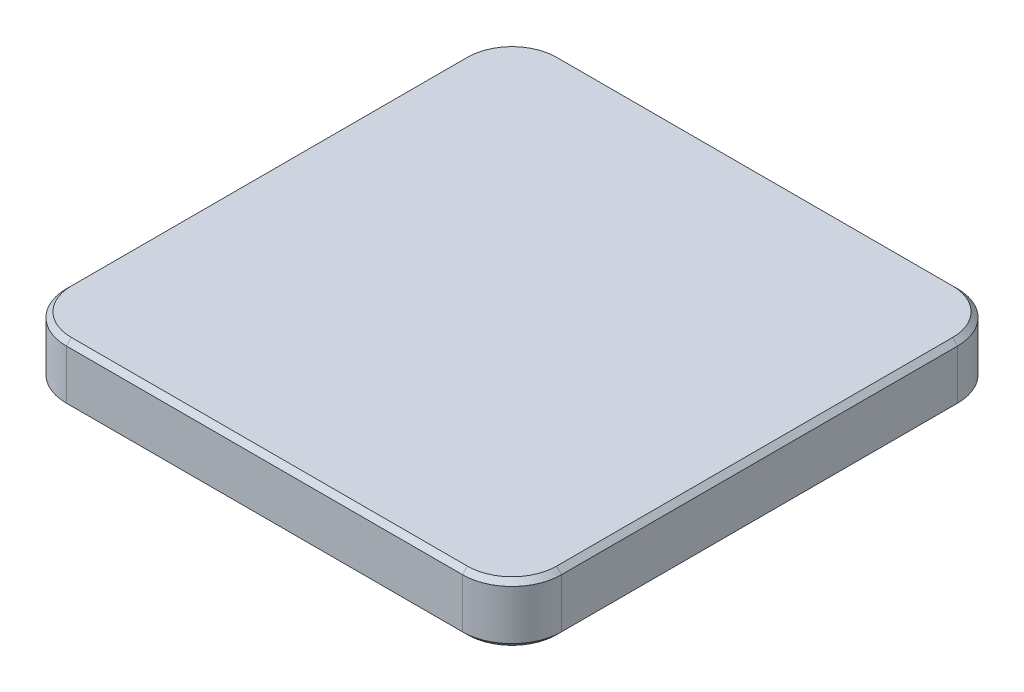
ISO-10303-21;
HEADER;
FILE_DESCRIPTION(('STEP AP214'),'2;1');
FILE_NAME('part.step','',(''),(''),'','','');
FILE_SCHEMA(('AUTOMOTIVE_DESIGN { 1 0 10303 214 1 1 1 1 }'));
ENDSEC;
DATA;
#1=APPLICATION_CONTEXT('core data for automotive mechanical design processes');
#2=APPLICATION_PROTOCOL_DEFINITION('international standard','automotive_design',2000,#1);
#3=PRODUCT_CONTEXT('',#1,'mechanical');
#4=PRODUCT('Part','Part','',(#3));
#5=PRODUCT_RELATED_PRODUCT_CATEGORY('part','',(#4));
#6=PRODUCT_DEFINITION_FORMATION('','',#4);
#7=PRODUCT_DEFINITION_CONTEXT('part definition',#1,'design');
#8=PRODUCT_DEFINITION('design','',#6,#7);
#9=PRODUCT_DEFINITION_SHAPE('','',#8);
#10=(LENGTH_UNIT() NAMED_UNIT(*) SI_UNIT(.MILLI.,.METRE.));
#11=(NAMED_UNIT(*) PLANE_ANGLE_UNIT() SI_UNIT($,.RADIAN.));
#12=(NAMED_UNIT(*) SI_UNIT($,.STERADIAN.) SOLID_ANGLE_UNIT());
#13=UNCERTAINTY_MEASURE_WITH_UNIT(LENGTH_MEASURE(1.E-05),#10,'distance_accuracy_value','');
#14=(GEOMETRIC_REPRESENTATION_CONTEXT(3) GLOBAL_UNCERTAINTY_ASSIGNED_CONTEXT((#13)) GLOBAL_UNIT_ASSIGNED_CONTEXT((#10,
#11,#12)) REPRESENTATION_CONTEXT('',''));
#15=CARTESIAN_POINT('',(0.,0.,0.));
#16=DIRECTION('',(0.,0.,1.));
#17=DIRECTION('',(1.,0.,0.));
#18=AXIS2_PLACEMENT_3D('',#15,#16,#17);
#19=CARTESIAN_POINT('',(40.,12.,40.));
#20=DIRECTION('',(0.,-1.,0.));
#21=DIRECTION('',(0.,0.,-1.));
#22=AXIS2_PLACEMENT_3D('',#19,#20,#21);
#23=CYLINDRICAL_SURFACE('',#22,10.);
#24=DIRECTION('',(0.,-1.,0.));
#25=VECTOR('',#24,1.);
#26=CARTESIAN_POINT('',(40.,12.,50.));
#27=LINE('',#26,#25);
#28=CARTESIAN_POINT('',(40.,11.,50.));
#29=VERTEX_POINT('',#28);
#30=CARTESIAN_POINT('',(40.,0.999999999999961,50.));
#31=VERTEX_POINT('',#30);
#32=EDGE_CURVE('E317',#29,#31,#27,.T.);
#33=ORIENTED_EDGE('',*,*,#32,.T.);
#34=CARTESIAN_POINT('',(40.,0.999999999999961,40.));
#35=DIRECTION('',(0.,1.,0.));
#36=DIRECTION('',(0.,0.,1.));
#37=AXIS2_PLACEMENT_3D('',#34,#35,#36);
#38=CIRCLE('',#37,10.);
#39=CARTESIAN_POINT('',(50.,0.999999999999961,40.));
#40=VERTEX_POINT('',#39);
#41=EDGE_CURVE('E266',#31,#40,#38,.T.);
#42=ORIENTED_EDGE('',*,*,#41,.T.);
#43=DIRECTION('',(0.,-1.,0.));
#44=VECTOR('',#43,1.);
#45=CARTESIAN_POINT('',(50.,12.,40.));
#46=LINE('',#45,#44);
#47=CARTESIAN_POINT('',(50.,11.,40.));
#48=VERTEX_POINT('',#47);
#49=EDGE_CURVE('E181',#48,#40,#46,.T.);
#50=ORIENTED_EDGE('',*,*,#49,.F.);
#51=CARTESIAN_POINT('',(40.,11.,40.));
#52=DIRECTION('',(0.,1.,0.));
#53=DIRECTION('',(0.,0.,1.));
#54=AXIS2_PLACEMENT_3D('',#51,#52,#53);
#55=CIRCLE('',#54,10.);
#56=EDGE_CURVE('E263',#48,#29,#55,.F.);
#57=ORIENTED_EDGE('',*,*,#56,.T.);
#58=EDGE_LOOP('',(#33,#42,#50,#57));
#59=FACE_BOUND('',#58,.T.);
#60=ADVANCED_FACE('F41',(#59),#23,.T.);
#61=CARTESIAN_POINT('',(50.,12.,40.));
#62=DIRECTION('',(-1.,0.,0.));
#63=DIRECTION('',(0.,0.,1.));
#64=AXIS2_PLACEMENT_3D('',#61,#62,#63);
#65=PLANE('',#64);
#66=ORIENTED_EDGE('',*,*,#49,.T.);
#67=DIRECTION('',(0.,0.,-1.));
#68=VECTOR('',#67,1.);
#69=CARTESIAN_POINT('',(50.,0.999999999999961,40.));
#70=LINE('',#69,#68);
#71=CARTESIAN_POINT('',(50.,0.999999999999961,-40.));
#72=VERTEX_POINT('',#71);
#73=EDGE_CURVE('E179',#40,#72,#70,.T.);
#74=ORIENTED_EDGE('',*,*,#73,.T.);
#75=DIRECTION('',(0.,-1.,0.));
#76=VECTOR('',#75,1.);
#77=CARTESIAN_POINT('',(50.,12.,-40.));
#78=LINE('',#77,#76);
#79=CARTESIAN_POINT('',(50.,11.,-40.));
#80=VERTEX_POINT('',#79);
#81=EDGE_CURVE('E160',#80,#72,#78,.T.);
#82=ORIENTED_EDGE('',*,*,#81,.F.);
#83=DIRECTION('',(0.,0.,1.));
#84=VECTOR('',#83,1.);
#85=CARTESIAN_POINT('',(50.,11.,40.));
#86=LINE('',#85,#84);
#87=EDGE_CURVE('E176',#80,#48,#86,.T.);
#88=ORIENTED_EDGE('',*,*,#87,.T.);
#89=EDGE_LOOP('',(#66,#74,#82,#88));
#90=FACE_BOUND('',#89,.T.);
#91=ADVANCED_FACE('F174',(#90),#65,.F.);
#92=CARTESIAN_POINT('',(40.,12.,-40.));
#93=DIRECTION('',(0.,-1.,0.));
#94=DIRECTION('',(0.,0.,-1.));
#95=AXIS2_PLACEMENT_3D('',#92,#93,#94);
#96=CYLINDRICAL_SURFACE('',#95,10.);
#97=ORIENTED_EDGE('',*,*,#81,.T.);
#98=CARTESIAN_POINT('',(40.,0.999999999999961,-40.));
#99=DIRECTION('',(0.,1.,0.));
#100=DIRECTION('',(0.,0.,1.));
#101=AXIS2_PLACEMENT_3D('',#98,#99,#100);
#102=CIRCLE('',#101,10.);
#103=CARTESIAN_POINT('',(40.,0.999999999999961,-50.));
#104=VERTEX_POINT('',#103);
#105=EDGE_CURVE('E168',#72,#104,#102,.T.);
#106=ORIENTED_EDGE('',*,*,#105,.T.);
#107=DIRECTION('',(0.,-1.,0.));
#108=VECTOR('',#107,1.);
#109=CARTESIAN_POINT('',(40.,12.,-50.));
#110=LINE('',#109,#108);
#111=CARTESIAN_POINT('',(40.,11.,-50.));
#112=VERTEX_POINT('',#111);
#113=EDGE_CURVE('E162',#112,#104,#110,.T.);
#114=ORIENTED_EDGE('',*,*,#113,.F.);
#115=CARTESIAN_POINT('',(40.,11.,-40.));
#116=DIRECTION('',(0.,1.,0.));
#117=DIRECTION('',(0.,0.,1.));
#118=AXIS2_PLACEMENT_3D('',#115,#116,#117);
#119=CIRCLE('',#118,10.);
#120=EDGE_CURVE('E157',#112,#80,#119,.F.);
#121=ORIENTED_EDGE('',*,*,#120,.T.);
#122=EDGE_LOOP('',(#97,#106,#114,#121));
#123=FACE_BOUND('',#122,.T.);
#124=ADVANCED_FACE('F159',(#123),#96,.T.);
#125=CARTESIAN_POINT('',(40.,12.,-50.));
#126=DIRECTION('',(0.,0.,1.));
#127=DIRECTION('',(1.,0.,0.));
#128=AXIS2_PLACEMENT_3D('',#125,#126,#127);
#129=PLANE('',#128);
#130=ORIENTED_EDGE('',*,*,#113,.T.);
#131=DIRECTION('',(-1.,0.,0.));
#132=VECTOR('',#131,1.);
#133=CARTESIAN_POINT('',(40.,0.999999999999961,-50.));
#134=LINE('',#133,#132);
#135=CARTESIAN_POINT('',(-40.,0.999999999999961,-50.));
#136=VERTEX_POINT('',#135);
#137=EDGE_CURVE('E235',#104,#136,#134,.T.);
#138=ORIENTED_EDGE('',*,*,#137,.T.);
#139=DIRECTION('',(0.,-1.,0.));
#140=VECTOR('',#139,1.);
#141=CARTESIAN_POINT('',(-40.,12.,-50.));
#142=LINE('',#141,#140);
#143=CARTESIAN_POINT('',(-40.,11.,-50.));
#144=VERTEX_POINT('',#143);
#145=EDGE_CURVE('E349',#144,#136,#142,.T.);
#146=ORIENTED_EDGE('',*,*,#145,.F.);
#147=DIRECTION('',(1.,0.,0.));
#148=VECTOR('',#147,1.);
#149=CARTESIAN_POINT('',(40.,11.,-50.));
#150=LINE('',#149,#148);
#151=EDGE_CURVE('E232',#144,#112,#150,.T.);
#152=ORIENTED_EDGE('',*,*,#151,.T.);
#153=EDGE_LOOP('',(#130,#138,#146,#152));
#154=FACE_BOUND('',#153,.T.);
#155=ADVANCED_FACE('F346',(#154),#129,.F.);
#156=CARTESIAN_POINT('',(-40.,12.,-40.));
#157=DIRECTION('',(0.,-1.,0.));
#158=DIRECTION('',(0.,0.,-1.));
#159=AXIS2_PLACEMENT_3D('',#156,#157,#158);
#160=CYLINDRICAL_SURFACE('',#159,10.);
#161=ORIENTED_EDGE('',*,*,#145,.T.);
#162=CARTESIAN_POINT('',(-40.,0.999999999999961,-40.));
#163=DIRECTION('',(0.,1.,0.));
#164=DIRECTION('',(0.,0.,1.));
#165=AXIS2_PLACEMENT_3D('',#162,#163,#164);
#166=CIRCLE('',#165,10.);
#167=CARTESIAN_POINT('',(-50.,0.999999999999961,-40.));
#168=VERTEX_POINT('',#167);
#169=EDGE_CURVE('E241',#136,#168,#166,.T.);
#170=ORIENTED_EDGE('',*,*,#169,.T.);
#171=DIRECTION('',(0.,-1.,0.));
#172=VECTOR('',#171,1.);
#173=CARTESIAN_POINT('',(-50.,12.,-40.));
#174=LINE('',#173,#172);
#175=CARTESIAN_POINT('',(-50.,11.,-40.));
#176=VERTEX_POINT('',#175);
#177=EDGE_CURVE('E353',#176,#168,#174,.T.);
#178=ORIENTED_EDGE('',*,*,#177,.F.);
#179=CARTESIAN_POINT('',(-40.,11.,-40.));
#180=DIRECTION('',(0.,1.,0.));
#181=DIRECTION('',(0.,0.,1.));
#182=AXIS2_PLACEMENT_3D('',#179,#180,#181);
#183=CIRCLE('',#182,10.);
#184=EDGE_CURVE('E238',#176,#144,#183,.F.);
#185=ORIENTED_EDGE('',*,*,#184,.T.);
#186=EDGE_LOOP('',(#161,#170,#178,#185));
#187=FACE_BOUND('',#186,.T.);
#188=ADVANCED_FACE('F403',(#187),#160,.T.);
#189=CARTESIAN_POINT('',(-50.,12.,-40.));
#190=DIRECTION('',(1.,0.,0.));
#191=DIRECTION('',(0.,0.,-1.));
#192=AXIS2_PLACEMENT_3D('',#189,#190,#191);
#193=PLANE('',#192);
#194=ORIENTED_EDGE('',*,*,#177,.T.);
#195=DIRECTION('',(0.,0.,1.));
#196=VECTOR('',#195,1.);
#197=CARTESIAN_POINT('',(-50.,0.999999999999961,-40.));
#198=LINE('',#197,#196);
#199=CARTESIAN_POINT('',(-50.,0.999999999999961,40.));
#200=VERTEX_POINT('',#199);
#201=EDGE_CURVE('E247',#168,#200,#198,.T.);
#202=ORIENTED_EDGE('',*,*,#201,.T.);
#203=DIRECTION('',(0.,-1.,0.));
#204=VECTOR('',#203,1.);
#205=CARTESIAN_POINT('',(-50.,12.,40.));
#206=LINE('',#205,#204);
#207=CARTESIAN_POINT('',(-50.,11.,40.));
#208=VERTEX_POINT('',#207);
#209=EDGE_CURVE('E359',#208,#200,#206,.T.);
#210=ORIENTED_EDGE('',*,*,#209,.F.);
#211=DIRECTION('',(0.,0.,-1.));
#212=VECTOR('',#211,1.);
#213=CARTESIAN_POINT('',(-50.,11.,-40.));
#214=LINE('',#213,#212);
#215=EDGE_CURVE('E244',#208,#176,#214,.T.);
#216=ORIENTED_EDGE('',*,*,#215,.T.);
#217=EDGE_LOOP('',(#194,#202,#210,#216));
#218=FACE_BOUND('',#217,.T.);
#219=ADVANCED_FACE('F406',(#218),#193,.F.);
#220=CARTESIAN_POINT('',(-40.,12.,40.));
#221=DIRECTION('',(0.,-1.,0.));
#222=DIRECTION('',(0.,0.,-1.));
#223=AXIS2_PLACEMENT_3D('',#220,#221,#222);
#224=CYLINDRICAL_SURFACE('',#223,10.);
#225=ORIENTED_EDGE('',*,*,#209,.T.);
#226=CARTESIAN_POINT('',(-40.,0.999999999999961,40.));
#227=DIRECTION('',(0.,1.,0.));
#228=DIRECTION('',(0.,0.,1.));
#229=AXIS2_PLACEMENT_3D('',#226,#227,#228);
#230=CIRCLE('',#229,10.);
#231=CARTESIAN_POINT('',(-40.,0.999999999999961,50.));
#232=VERTEX_POINT('',#231);
#233=EDGE_CURVE('E253',#200,#232,#230,.T.);
#234=ORIENTED_EDGE('',*,*,#233,.T.);
#235=DIRECTION('',(0.,-1.,0.));
#236=VECTOR('',#235,1.);
#237=CARTESIAN_POINT('',(-40.,12.,50.));
#238=LINE('',#237,#236);
#239=CARTESIAN_POINT('',(-40.,11.,50.));
#240=VERTEX_POINT('',#239);
#241=EDGE_CURVE('E365',#240,#232,#238,.T.);
#242=ORIENTED_EDGE('',*,*,#241,.F.);
#243=CARTESIAN_POINT('',(-40.,11.,40.));
#244=DIRECTION('',(0.,1.,0.));
#245=DIRECTION('',(0.,0.,1.));
#246=AXIS2_PLACEMENT_3D('',#243,#244,#245);
#247=CIRCLE('',#246,10.);
#248=EDGE_CURVE('E250',#240,#208,#247,.F.);
#249=ORIENTED_EDGE('',*,*,#248,.T.);
#250=EDGE_LOOP('',(#225,#234,#242,#249));
#251=FACE_BOUND('',#250,.T.);
#252=ADVANCED_FACE('F420',(#251),#224,.T.);
#253=CARTESIAN_POINT('',(-40.,12.,50.));
#254=DIRECTION('',(0.,0.,-1.));
#255=DIRECTION('',(-1.,0.,0.));
#256=AXIS2_PLACEMENT_3D('',#253,#254,#255);
#257=PLANE('',#256);
#258=ORIENTED_EDGE('',*,*,#241,.T.);
#259=DIRECTION('',(1.,0.,0.));
#260=VECTOR('',#259,1.);
#261=CARTESIAN_POINT('',(-40.,0.999999999999961,50.));
#262=LINE('',#261,#260);
#263=EDGE_CURVE('E260',#232,#31,#262,.T.);
#264=ORIENTED_EDGE('',*,*,#263,.T.);
#265=ORIENTED_EDGE('',*,*,#32,.F.);
#266=DIRECTION('',(-1.,0.,0.));
#267=VECTOR('',#266,1.);
#268=CARTESIAN_POINT('',(-40.,11.,50.));
#269=LINE('',#268,#267);
#270=EDGE_CURVE('E256',#29,#240,#269,.T.);
#271=ORIENTED_EDGE('',*,*,#270,.T.);
#272=EDGE_LOOP('',(#258,#264,#265,#271));
#273=FACE_BOUND('',#272,.T.);
#274=ADVANCED_FACE('F421',(#273),#257,.F.);
#275=CARTESIAN_POINT('',(40.,12.,40.));
#276=DIRECTION('',(0.,1.,0.));
#277=DIRECTION('',(0.,0.,1.));
#278=AXIS2_PLACEMENT_3D('',#275,#276,#277);
#279=PLANE('',#278);
#280=CARTESIAN_POINT('',(-40.,12.,40.));
#281=DIRECTION('',(0.,1.,0.));
#282=DIRECTION('',(0.,0.,1.));
#283=AXIS2_PLACEMENT_3D('',#280,#281,#282);
#284=CIRCLE('',#283,9.00000000000001);
#285=CARTESIAN_POINT('',(-49.,12.,40.));
#286=VERTEX_POINT('',#285);
#287=CARTESIAN_POINT('',(-40.,12.,49.));
#288=VERTEX_POINT('',#287);
#289=EDGE_CURVE('E52',#286,#288,#284,.T.);
#290=ORIENTED_EDGE('',*,*,#289,.T.);
#291=DIRECTION('',(1.,0.,0.));
#292=VECTOR('',#291,1.);
#293=CARTESIAN_POINT('',(40.,12.,49.));
#294=LINE('',#293,#292);
#295=CARTESIAN_POINT('',(40.,12.,49.));
#296=VERTEX_POINT('',#295);
#297=EDGE_CURVE('E11',#288,#296,#294,.T.);
#298=ORIENTED_EDGE('',*,*,#297,.T.);
#299=CARTESIAN_POINT('',(40.,12.,40.));
#300=DIRECTION('',(0.,1.,0.));
#301=DIRECTION('',(0.,0.,1.));
#302=AXIS2_PLACEMENT_3D('',#299,#300,#301);
#303=CIRCLE('',#302,9.00000000000001);
#304=CARTESIAN_POINT('',(49.,12.,40.));
#305=VERTEX_POINT('',#304);
#306=EDGE_CURVE('E269',#296,#305,#303,.T.);
#307=ORIENTED_EDGE('',*,*,#306,.T.);
#308=DIRECTION('',(0.,0.,-1.));
#309=VECTOR('',#308,1.);
#310=CARTESIAN_POINT('',(49.,12.,-40.));
#311=LINE('',#310,#309);
#312=CARTESIAN_POINT('',(49.,12.,-40.));
#313=VERTEX_POINT('',#312);
#314=EDGE_CURVE('E272',#305,#313,#311,.T.);
#315=ORIENTED_EDGE('',*,*,#314,.T.);
#316=CARTESIAN_POINT('',(40.,12.,-40.));
#317=DIRECTION('',(0.,1.,0.));
#318=DIRECTION('',(0.,0.,1.));
#319=AXIS2_PLACEMENT_3D('',#316,#317,#318);
#320=CIRCLE('',#319,9.00000000000001);
#321=CARTESIAN_POINT('',(40.,12.,-49.));
#322=VERTEX_POINT('',#321);
#323=EDGE_CURVE('E187',#313,#322,#320,.T.);
#324=ORIENTED_EDGE('',*,*,#323,.T.);
#325=DIRECTION('',(-1.,0.,0.));
#326=VECTOR('',#325,1.);
#327=CARTESIAN_POINT('',(-40.,12.,-49.));
#328=LINE('',#327,#326);
#329=CARTESIAN_POINT('',(-40.,12.,-49.));
#330=VERTEX_POINT('',#329);
#331=EDGE_CURVE('E277',#322,#330,#328,.T.);
#332=ORIENTED_EDGE('',*,*,#331,.T.);
#333=CARTESIAN_POINT('',(-40.,12.,-40.));
#334=DIRECTION('',(0.,1.,0.));
#335=DIRECTION('',(0.,0.,1.));
#336=AXIS2_PLACEMENT_3D('',#333,#334,#335);
#337=CIRCLE('',#336,9.);
#338=CARTESIAN_POINT('',(-49.,12.,-40.));
#339=VERTEX_POINT('',#338);
#340=EDGE_CURVE('E280',#330,#339,#337,.T.);
#341=ORIENTED_EDGE('',*,*,#340,.T.);
#342=DIRECTION('',(0.,0.,1.));
#343=VECTOR('',#342,1.);
#344=CARTESIAN_POINT('',(-49.,12.,40.));
#345=LINE('',#344,#343);
#346=EDGE_CURVE('E63',#339,#286,#345,.T.);
#347=ORIENTED_EDGE('',*,*,#346,.T.);
#348=EDGE_LOOP('',(#290,#298,#307,#315,#324,#332,#341,#347));
#349=FACE_BOUND('',#348,.T.);
#350=ADVANCED_FACE('F430',(#349),#279,.T.);
#351=CARTESIAN_POINT('',(40.,0.,40.));
#352=DIRECTION('',(0.,1.,0.));
#353=DIRECTION('',(0.,0.,1.));
#354=AXIS2_PLACEMENT_3D('',#351,#352,#353);
#355=PLANE('',#354);
#356=CARTESIAN_POINT('',(40.,0.,-40.));
#357=DIRECTION('',(0.,1.,0.));
#358=DIRECTION('',(0.,0.,1.));
#359=AXIS2_PLACEMENT_3D('',#356,#357,#358);
#360=CIRCLE('',#359,9.00000000000005);
#361=CARTESIAN_POINT('',(40.,0.,-49.));
#362=VERTEX_POINT('',#361);
#363=CARTESIAN_POINT('',(49.,0.,-40.));
#364=VERTEX_POINT('',#363);
#365=EDGE_CURVE('E224',#362,#364,#360,.F.);
#366=ORIENTED_EDGE('',*,*,#365,.T.);
#367=DIRECTION('',(0.,0.,1.));
#368=VECTOR('',#367,1.);
#369=CARTESIAN_POINT('',(49.,0.,40.));
#370=LINE('',#369,#368);
#371=CARTESIAN_POINT('',(49.,0.,40.));
#372=VERTEX_POINT('',#371);
#373=EDGE_CURVE('E169',#364,#372,#370,.T.);
#374=ORIENTED_EDGE('',*,*,#373,.T.);
#375=CARTESIAN_POINT('',(40.,0.,40.));
#376=DIRECTION('',(0.,1.,0.));
#377=DIRECTION('',(0.,0.,1.));
#378=AXIS2_PLACEMENT_3D('',#375,#376,#377);
#379=CIRCLE('',#378,9.00000000000005);
#380=CARTESIAN_POINT('',(40.,0.,49.));
#381=VERTEX_POINT('',#380);
#382=EDGE_CURVE('E203',#372,#381,#379,.F.);
#383=ORIENTED_EDGE('',*,*,#382,.T.);
#384=DIRECTION('',(-1.,0.,0.));
#385=VECTOR('',#384,1.);
#386=CARTESIAN_POINT('',(40.,0.,49.));
#387=LINE('',#386,#385);
#388=CARTESIAN_POINT('',(-40.,0.,49.));
#389=VERTEX_POINT('',#388);
#390=EDGE_CURVE('E209',#381,#389,#387,.T.);
#391=ORIENTED_EDGE('',*,*,#390,.T.);
#392=CARTESIAN_POINT('',(-40.,0.,40.));
#393=DIRECTION('',(0.,1.,0.));
#394=DIRECTION('',(0.,0.,1.));
#395=AXIS2_PLACEMENT_3D('',#392,#393,#394);
#396=CIRCLE('',#395,9.00000000000005);
#397=CARTESIAN_POINT('',(-49.,0.,40.));
#398=VERTEX_POINT('',#397);
#399=EDGE_CURVE('E212',#389,#398,#396,.F.);
#400=ORIENTED_EDGE('',*,*,#399,.T.);
#401=DIRECTION('',(0.,0.,-1.));
#402=VECTOR('',#401,1.);
#403=CARTESIAN_POINT('',(-49.,0.,40.));
#404=LINE('',#403,#402);
#405=CARTESIAN_POINT('',(-49.,0.,-40.));
#406=VERTEX_POINT('',#405);
#407=EDGE_CURVE('E215',#398,#406,#404,.T.);
#408=ORIENTED_EDGE('',*,*,#407,.T.);
#409=CARTESIAN_POINT('',(-40.,0.,-40.));
#410=DIRECTION('',(0.,1.,0.));
#411=DIRECTION('',(0.,0.,1.));
#412=AXIS2_PLACEMENT_3D('',#409,#410,#411);
#413=CIRCLE('',#412,9.00000000000004);
#414=CARTESIAN_POINT('',(-40.,0.,-49.));
#415=VERTEX_POINT('',#414);
#416=EDGE_CURVE('E218',#406,#415,#413,.F.);
#417=ORIENTED_EDGE('',*,*,#416,.T.);
#418=DIRECTION('',(1.,0.,0.));
#419=VECTOR('',#418,1.);
#420=CARTESIAN_POINT('',(40.,0.,-49.));
#421=LINE('',#420,#419);
#422=EDGE_CURVE('E221',#415,#362,#421,.T.);
#423=ORIENTED_EDGE('',*,*,#422,.T.);
#424=EDGE_LOOP('',(#366,#374,#383,#391,#400,#408,#417,#423));
#425=FACE_BOUND('',#424,.T.);
#426=ADVANCED_FACE('F432',(#425),#355,.F.);
#427=CARTESIAN_POINT('',(-50.,0.999999999999961,-40.));
#428=DIRECTION('',(0.707106781186548,0.707106781186547,0.));
#429=DIRECTION('',(0.,0.,1.));
#430=AXIS2_PLACEMENT_3D('',#427,#428,#429);
#431=PLANE('',#430);
#432=DIRECTION('',(-0.707106781186547,0.707106781186548,0.));
#433=VECTOR('',#432,1.);
#434=CARTESIAN_POINT('',(-49.,0.,-40.));
#435=LINE('',#434,#433);
#436=EDGE_CURVE('E309',#406,#168,#435,.T.);
#437=ORIENTED_EDGE('',*,*,#436,.F.);
#438=ORIENTED_EDGE('',*,*,#407,.F.);
#439=DIRECTION('',(0.707106781186547,-0.707106781186548,0.));
#440=VECTOR('',#439,1.);
#441=CARTESIAN_POINT('',(-50.,0.999999999999961,40.));
#442=LINE('',#441,#440);
#443=EDGE_CURVE('E313',#200,#398,#442,.T.);
#444=ORIENTED_EDGE('',*,*,#443,.F.);
#445=ORIENTED_EDGE('',*,*,#201,.F.);
#446=EDGE_LOOP('',(#437,#438,#444,#445));
#447=FACE_BOUND('',#446,.T.);
#448=ADVANCED_FACE('F411',(#447),#431,.F.);
#449=CARTESIAN_POINT('',(-40.,0.999999999999961,40.));
#450=DIRECTION('',(0.,1.,0.));
#451=DIRECTION('',(0.,0.,1.));
#452=AXIS2_PLACEMENT_3D('',#449,#450,#451);
#453=CONICAL_SURFACE('',#452,10.,0.785398163397446);
#454=ORIENTED_EDGE('',*,*,#443,.T.);
#455=ORIENTED_EDGE('',*,*,#399,.F.);
#456=DIRECTION('',(0.,-0.707106781186551,-0.707106781186544));
#457=VECTOR('',#456,1.);
#458=CARTESIAN_POINT('',(-40.,0.999999999999961,50.));
#459=LINE('',#458,#457);
#460=EDGE_CURVE('E305',#232,#389,#459,.T.);
#461=ORIENTED_EDGE('',*,*,#460,.F.);
#462=ORIENTED_EDGE('',*,*,#233,.F.);
#463=EDGE_LOOP('',(#454,#455,#461,#462));
#464=FACE_BOUND('',#463,.T.);
#465=ADVANCED_FACE('F417',(#464),#453,.T.);
#466=CARTESIAN_POINT('',(-40.,0.999999999999961,-40.));
#467=DIRECTION('',(0.,1.,0.));
#468=DIRECTION('',(0.,0.,1.));
#469=AXIS2_PLACEMENT_3D('',#466,#467,#468);
#470=CONICAL_SURFACE('',#469,10.,0.785398163397446);
#471=ORIENTED_EDGE('',*,*,#436,.T.);
#472=ORIENTED_EDGE('',*,*,#169,.F.);
#473=DIRECTION('',(0.,0.707106781186548,-0.707106781186547));
#474=VECTOR('',#473,1.);
#475=CARTESIAN_POINT('',(-40.,0.,-49.));
#476=LINE('',#475,#474);
#477=EDGE_CURVE('E301',#415,#136,#476,.T.);
#478=ORIENTED_EDGE('',*,*,#477,.F.);
#479=ORIENTED_EDGE('',*,*,#416,.F.);
#480=EDGE_LOOP('',(#471,#472,#478,#479));
#481=FACE_BOUND('',#480,.T.);
#482=ADVANCED_FACE('F400',(#481),#470,.T.);
#483=CARTESIAN_POINT('',(-40.,0.999999999999961,50.));
#484=DIRECTION('',(0.,0.707106781186547,-0.707106781186548));
#485=DIRECTION('',(1.,0.,0.));
#486=AXIS2_PLACEMENT_3D('',#483,#484,#485);
#487=PLANE('',#486);
#488=ORIENTED_EDGE('',*,*,#460,.T.);
#489=ORIENTED_EDGE('',*,*,#390,.F.);
#490=DIRECTION('',(0.,-0.707106781186548,-0.707106781186547));
#491=VECTOR('',#490,1.);
#492=CARTESIAN_POINT('',(40.,0.999999999999961,50.));
#493=LINE('',#492,#491);
#494=EDGE_CURVE('E297',#31,#381,#493,.T.);
#495=ORIENTED_EDGE('',*,*,#494,.F.);
#496=ORIENTED_EDGE('',*,*,#263,.F.);
#497=EDGE_LOOP('',(#488,#489,#495,#496));
#498=FACE_BOUND('',#497,.T.);
#499=ADVANCED_FACE('F380',(#498),#487,.F.);
#500=CARTESIAN_POINT('',(40.,0.999999999999961,-50.));
#501=DIRECTION('',(0.,0.707106781186544,0.707106781186551));
#502=DIRECTION('',(-1.,0.,0.));
#503=AXIS2_PLACEMENT_3D('',#500,#501,#502);
#504=PLANE('',#503);
#505=ORIENTED_EDGE('',*,*,#477,.T.);
#506=ORIENTED_EDGE('',*,*,#137,.F.);
#507=DIRECTION('',(0.,0.707106781186551,-0.707106781186544));
#508=VECTOR('',#507,1.);
#509=CARTESIAN_POINT('',(40.,0.,-49.));
#510=LINE('',#509,#508);
#511=EDGE_CURVE('E293',#362,#104,#510,.T.);
#512=ORIENTED_EDGE('',*,*,#511,.F.);
#513=ORIENTED_EDGE('',*,*,#422,.F.);
#514=EDGE_LOOP('',(#505,#506,#512,#513));
#515=FACE_BOUND('',#514,.T.);
#516=ADVANCED_FACE('F396',(#515),#504,.F.);
#517=CARTESIAN_POINT('',(40.,0.999999999999961,40.));
#518=DIRECTION('',(0.,1.,0.));
#519=DIRECTION('',(0.,0.,1.));
#520=AXIS2_PLACEMENT_3D('',#517,#518,#519);
#521=CONICAL_SURFACE('',#520,10.,0.785398163397446);
#522=ORIENTED_EDGE('',*,*,#494,.T.);
#523=ORIENTED_EDGE('',*,*,#382,.F.);
#524=DIRECTION('',(-0.707106781186547,-0.707106781186548,0.));
#525=VECTOR('',#524,1.);
#526=CARTESIAN_POINT('',(50.,0.999999999999961,40.));
#527=LINE('',#526,#525);
#528=EDGE_CURVE('E290',#40,#372,#527,.T.);
#529=ORIENTED_EDGE('',*,*,#528,.F.);
#530=ORIENTED_EDGE('',*,*,#41,.F.);
#531=EDGE_LOOP('',(#522,#523,#529,#530));
#532=FACE_BOUND('',#531,.T.);
#533=ADVANCED_FACE('F384',(#532),#521,.T.);
#534=CARTESIAN_POINT('',(40.,0.999999999999961,-40.));
#535=DIRECTION('',(0.,1.,0.));
#536=DIRECTION('',(0.,0.,1.));
#537=AXIS2_PLACEMENT_3D('',#534,#535,#536);
#538=CONICAL_SURFACE('',#537,10.,0.785398163397446);
#539=ORIENTED_EDGE('',*,*,#511,.T.);
#540=ORIENTED_EDGE('',*,*,#105,.F.);
#541=DIRECTION('',(0.707106781186547,0.707106781186548,0.));
#542=VECTOR('',#541,1.);
#543=CARTESIAN_POINT('',(49.,0.,-40.));
#544=LINE('',#543,#542);
#545=EDGE_CURVE('E287',#364,#72,#544,.T.);
#546=ORIENTED_EDGE('',*,*,#545,.F.);
#547=ORIENTED_EDGE('',*,*,#365,.F.);
#548=EDGE_LOOP('',(#539,#540,#546,#547));
#549=FACE_BOUND('',#548,.T.);
#550=ADVANCED_FACE('F392',(#549),#538,.T.);
#551=CARTESIAN_POINT('',(50.,0.999999999999961,40.));
#552=DIRECTION('',(-0.707106781186548,0.707106781186547,0.));
#553=DIRECTION('',(0.,0.,-1.));
#554=AXIS2_PLACEMENT_3D('',#551,#552,#553);
#555=PLANE('',#554);
#556=ORIENTED_EDGE('',*,*,#528,.T.);
#557=ORIENTED_EDGE('',*,*,#373,.F.);
#558=ORIENTED_EDGE('',*,*,#545,.T.);
#559=ORIENTED_EDGE('',*,*,#73,.F.);
#560=EDGE_LOOP('',(#556,#557,#558,#559));
#561=FACE_BOUND('',#560,.T.);
#562=ADVANCED_FACE('F387',(#561),#555,.F.);
#563=CARTESIAN_POINT('',(40.,12.,-49.));
#564=DIRECTION('',(0.,0.707106781186544,-0.707106781186551));
#565=DIRECTION('',(1.,0.,0.));
#566=AXIS2_PLACEMENT_3D('',#563,#564,#565);
#567=PLANE('',#566);
#568=DIRECTION('',(0.,0.707106781186551,0.707106781186544));
#569=VECTOR('',#568,1.);
#570=CARTESIAN_POINT('',(40.,11.,-50.));
#571=LINE('',#570,#569);
#572=EDGE_CURVE('E331',#112,#322,#571,.T.);
#573=ORIENTED_EDGE('',*,*,#572,.F.);
#574=ORIENTED_EDGE('',*,*,#151,.F.);
#575=DIRECTION('',(0.,-0.707106781186551,-0.707106781186544));
#576=VECTOR('',#575,1.);
#577=CARTESIAN_POINT('',(-40.,12.,-49.));
#578=LINE('',#577,#576);
#579=EDGE_CURVE('E46',#330,#144,#578,.T.);
#580=ORIENTED_EDGE('',*,*,#579,.F.);
#581=ORIENTED_EDGE('',*,*,#331,.F.);
#582=EDGE_LOOP('',(#573,#574,#580,#581));
#583=FACE_BOUND('',#582,.T.);
#584=ADVANCED_FACE('F44',(#583),#567,.T.);
#585=CARTESIAN_POINT('',(-40.,12.,-40.));
#586=DIRECTION('',(0.,-1.,0.));
#587=DIRECTION('',(0.,0.,-1.));
#588=AXIS2_PLACEMENT_3D('',#585,#586,#587);
#589=CONICAL_SURFACE('',#588,9.,0.785398163397445);
#590=ORIENTED_EDGE('',*,*,#579,.T.);
#591=ORIENTED_EDGE('',*,*,#184,.F.);
#592=DIRECTION('',(-0.707106781186544,-0.707106781186551,0.));
#593=VECTOR('',#592,1.);
#594=CARTESIAN_POINT('',(-49.,12.,-40.));
#595=LINE('',#594,#593);
#596=EDGE_CURVE('E191',#339,#176,#595,.T.);
#597=ORIENTED_EDGE('',*,*,#596,.F.);
#598=ORIENTED_EDGE('',*,*,#340,.F.);
#599=EDGE_LOOP('',(#590,#591,#597,#598));
#600=FACE_BOUND('',#599,.T.);
#601=ADVANCED_FACE('F339',(#600),#589,.T.);
#602=CARTESIAN_POINT('',(40.,12.,-40.));
#603=DIRECTION('',(0.,-1.,0.));
#604=DIRECTION('',(0.,0.,-1.));
#605=AXIS2_PLACEMENT_3D('',#602,#603,#604);
#606=CONICAL_SURFACE('',#605,9.00000000000001,0.785398163397445);
#607=ORIENTED_EDGE('',*,*,#572,.T.);
#608=ORIENTED_EDGE('',*,*,#323,.F.);
#609=DIRECTION('',(-0.707106781186546,0.707106781186549,0.));
#610=VECTOR('',#609,1.);
#611=CARTESIAN_POINT('',(50.,11.,-40.));
#612=LINE('',#611,#610);
#613=EDGE_CURVE('E185',#80,#313,#612,.T.);
#614=ORIENTED_EDGE('',*,*,#613,.F.);
#615=ORIENTED_EDGE('',*,*,#120,.F.);
#616=EDGE_LOOP('',(#607,#608,#614,#615));
#617=FACE_BOUND('',#616,.T.);
#618=ADVANCED_FACE('F186',(#617),#606,.T.);
#619=CARTESIAN_POINT('',(-49.,12.,40.));
#620=DIRECTION('',(-0.707106781186549,0.707106781186546,0.));
#621=DIRECTION('',(0.,0.,-1.));
#622=AXIS2_PLACEMENT_3D('',#619,#620,#621);
#623=PLANE('',#622);
#624=ORIENTED_EDGE('',*,*,#596,.T.);
#625=ORIENTED_EDGE('',*,*,#215,.F.);
#626=DIRECTION('',(-0.707106781186546,-0.707106781186549,0.));
#627=VECTOR('',#626,1.);
#628=CARTESIAN_POINT('',(-49.,12.,40.));
#629=LINE('',#628,#627);
#630=EDGE_CURVE('E192',#286,#208,#629,.T.);
#631=ORIENTED_EDGE('',*,*,#630,.F.);
#632=ORIENTED_EDGE('',*,*,#346,.F.);
#633=EDGE_LOOP('',(#624,#625,#631,#632));
#634=FACE_BOUND('',#633,.T.);
#635=ADVANCED_FACE('F512',(#634),#623,.T.);
#636=CARTESIAN_POINT('',(49.,12.,40.));
#637=DIRECTION('',(0.707106781186551,0.707106781186544,0.));
#638=DIRECTION('',(0.,0.,1.));
#639=AXIS2_PLACEMENT_3D('',#636,#637,#638);
#640=PLANE('',#639);
#641=ORIENTED_EDGE('',*,*,#613,.T.);
#642=ORIENTED_EDGE('',*,*,#314,.F.);
#643=DIRECTION('',(-0.707106781186544,0.707106781186551,0.));
#644=VECTOR('',#643,1.);
#645=CARTESIAN_POINT('',(50.,11.,40.));
#646=LINE('',#645,#644);
#647=EDGE_CURVE('E197',#48,#305,#646,.T.);
#648=ORIENTED_EDGE('',*,*,#647,.F.);
#649=ORIENTED_EDGE('',*,*,#87,.F.);
#650=EDGE_LOOP('',(#641,#642,#648,#649));
#651=FACE_BOUND('',#650,.T.);
#652=ADVANCED_FACE('F195',(#651),#640,.T.);
#653=CARTESIAN_POINT('',(-40.,12.,40.));
#654=DIRECTION('',(0.,-1.,0.));
#655=DIRECTION('',(0.,0.,-1.));
#656=AXIS2_PLACEMENT_3D('',#653,#654,#655);
#657=CONICAL_SURFACE('',#656,9.00000000000001,0.785398163397445);
#658=ORIENTED_EDGE('',*,*,#630,.T.);
#659=ORIENTED_EDGE('',*,*,#248,.F.);
#660=DIRECTION('',(0.,-0.707106781186551,0.707106781186544));
#661=VECTOR('',#660,1.);
#662=CARTESIAN_POINT('',(-40.,12.,49.));
#663=LINE('',#662,#661);
#664=EDGE_CURVE('E321',#288,#240,#663,.T.);
#665=ORIENTED_EDGE('',*,*,#664,.F.);
#666=ORIENTED_EDGE('',*,*,#289,.F.);
#667=EDGE_LOOP('',(#658,#659,#665,#666));
#668=FACE_BOUND('',#667,.T.);
#669=ADVANCED_FACE('F500',(#668),#657,.T.);
#670=CARTESIAN_POINT('',(40.,12.,40.));
#671=DIRECTION('',(0.,-1.,0.));
#672=DIRECTION('',(0.,0.,-1.));
#673=AXIS2_PLACEMENT_3D('',#670,#671,#672);
#674=CONICAL_SURFACE('',#673,9.00000000000001,0.785398163397445);
#675=ORIENTED_EDGE('',*,*,#647,.T.);
#676=ORIENTED_EDGE('',*,*,#306,.F.);
#677=DIRECTION('',(0.,0.707106781186551,-0.707106781186544));
#678=VECTOR('',#677,1.);
#679=CARTESIAN_POINT('',(40.,11.,50.));
#680=LINE('',#679,#678);
#681=EDGE_CURVE('E318',#29,#296,#680,.T.);
#682=ORIENTED_EDGE('',*,*,#681,.F.);
#683=ORIENTED_EDGE('',*,*,#56,.F.);
#684=EDGE_LOOP('',(#675,#676,#682,#683));
#685=FACE_BOUND('',#684,.T.);
#686=ADVANCED_FACE('F429',(#685),#674,.T.);
#687=CARTESIAN_POINT('',(40.,12.,49.));
#688=DIRECTION('',(0.,0.707106781186544,0.707106781186551));
#689=DIRECTION('',(-1.,0.,0.));
#690=AXIS2_PLACEMENT_3D('',#687,#688,#689);
#691=PLANE('',#690);
#692=ORIENTED_EDGE('',*,*,#664,.T.);
#693=ORIENTED_EDGE('',*,*,#270,.F.);
#694=ORIENTED_EDGE('',*,*,#681,.T.);
#695=ORIENTED_EDGE('',*,*,#297,.F.);
#696=EDGE_LOOP('',(#692,#693,#694,#695));
#697=FACE_BOUND('',#696,.T.);
#698=ADVANCED_FACE('F424',(#697),#691,.T.);
#699=CLOSED_SHELL('',(#60,#91,#124,#155,#188,#219,#252,#274,#350,#426,#448,#465,#482,#499,#516,
#533,#550,#562,#584,#601,#618,#635,#652,#669,#686,#698));
#700=MANIFOLD_SOLID_BREP('B2',#699);
#701=ADVANCED_BREP_SHAPE_REPRESENTATION('',(#18,#700),#14);
#702=SHAPE_DEFINITION_REPRESENTATION(#9,#701);
ENDSEC;
END-ISO-10303-21;
